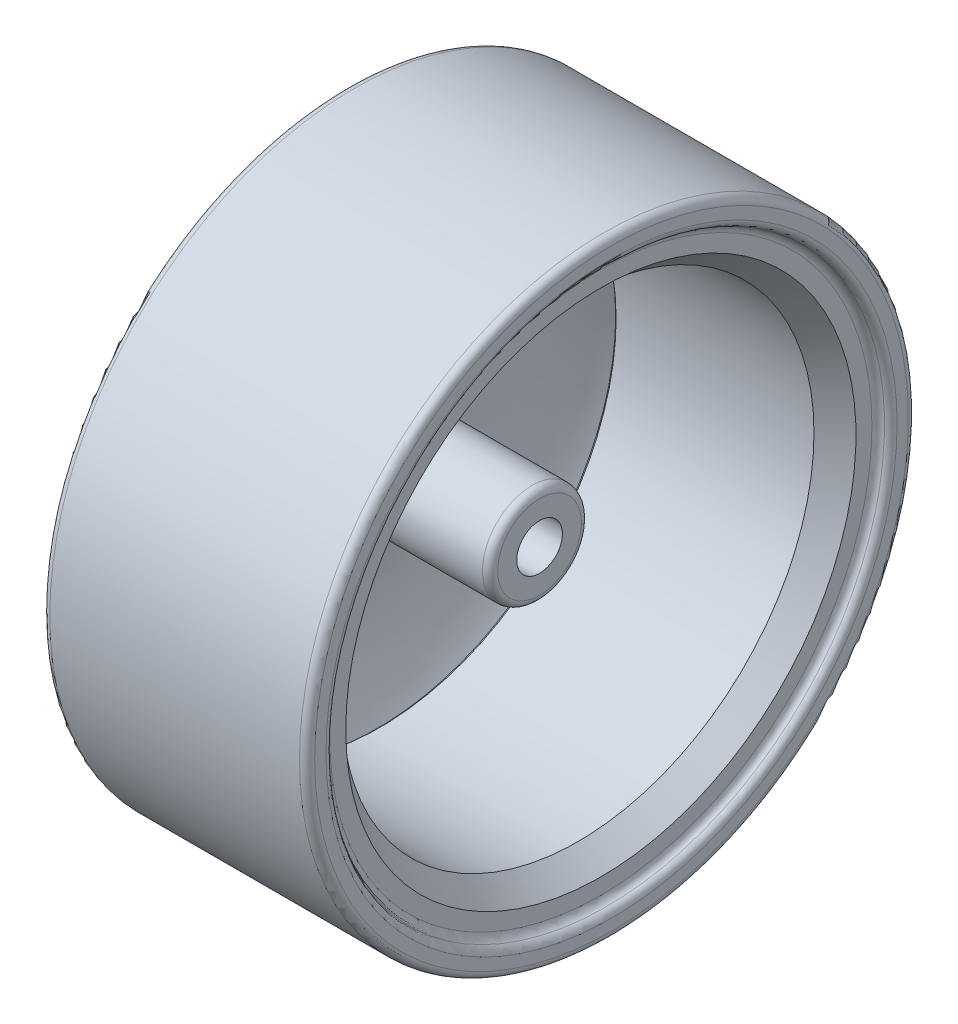
ISO-10303-21;
HEADER;
FILE_DESCRIPTION(('STEP AP214'),'2;1');
FILE_NAME('part.step','',(''),(''),'','','');
FILE_SCHEMA(('AUTOMOTIVE_DESIGN { 1 0 10303 214 1 1 1 1 }'));
ENDSEC;
DATA;
#1=APPLICATION_CONTEXT('core data for automotive mechanical design processes');
#2=APPLICATION_PROTOCOL_DEFINITION('international standard','automotive_design',2000,#1);
#3=PRODUCT_CONTEXT('',#1,'mechanical');
#4=PRODUCT('Part','Part','',(#3));
#5=PRODUCT_RELATED_PRODUCT_CATEGORY('part','',(#4));
#6=PRODUCT_DEFINITION_FORMATION('','',#4);
#7=PRODUCT_DEFINITION_CONTEXT('part definition',#1,'design');
#8=PRODUCT_DEFINITION('design','',#6,#7);
#9=PRODUCT_DEFINITION_SHAPE('','',#8);
#10=(LENGTH_UNIT() NAMED_UNIT(*) SI_UNIT(.MILLI.,.METRE.));
#11=(NAMED_UNIT(*) PLANE_ANGLE_UNIT() SI_UNIT($,.RADIAN.));
#12=(NAMED_UNIT(*) SI_UNIT($,.STERADIAN.) SOLID_ANGLE_UNIT());
#13=UNCERTAINTY_MEASURE_WITH_UNIT(LENGTH_MEASURE(1.E-05),#10,'distance_accuracy_value','');
#14=(GEOMETRIC_REPRESENTATION_CONTEXT(3) GLOBAL_UNCERTAINTY_ASSIGNED_CONTEXT((#13)) GLOBAL_UNIT_ASSIGNED_CONTEXT((#10,
#11,#12)) REPRESENTATION_CONTEXT('',''));
#15=CARTESIAN_POINT('',(0.,0.,0.));
#16=DIRECTION('',(0.,0.,1.));
#17=DIRECTION('',(1.,0.,0.));
#18=AXIS2_PLACEMENT_3D('',#15,#16,#17);
#19=CARTESIAN_POINT('',(-8.,0.,0.));
#20=DIRECTION('',(-1.,0.,0.));
#21=DIRECTION('',(0.,0.,1.));
#22=AXIS2_PLACEMENT_3D('',#19,#20,#21);
#23=CONICAL_SURFACE('',#22,16.7586494467659,0.698131700797733);
#24=CARTESIAN_POINT('',(-8.,0.,0.));
#25=DIRECTION('',(-1.,0.,0.));
#26=DIRECTION('',(0.,0.,1.));
#27=AXIS2_PLACEMENT_3D('',#24,#25,#26);
#28=CIRCLE('',#27,16.7586494467659);
#29=CARTESIAN_POINT('',(-7.99999999999999,0.,16.7586494467659));
#30=VERTEX_POINT('',#29);
#31=EDGE_CURVE('E103',#30,#30,#28,.T.);
#32=ORIENTED_EDGE('',*,*,#31,.T.);
#33=EDGE_LOOP('',(#32));
#34=FACE_BOUND('',#33,.T.);
#35=CARTESIAN_POINT('',(-7.24105039201976,0.,0.));
#36=DIRECTION('',(1.,0.,0.));
#37=DIRECTION('',(0.,0.,-1.));
#38=AXIS2_PLACEMENT_3D('',#35,#36,#37);
#39=CIRCLE('',#38,16.1218151106276);
#40=CARTESIAN_POINT('',(-7.24105039201976,0.,-16.1218151106276));
#41=VERTEX_POINT('',#40);
#42=EDGE_CURVE('E88',#41,#41,#39,.F.);
#43=ORIENTED_EDGE('',*,*,#42,.F.);
#44=EDGE_LOOP('',(#43));
#45=FACE_BOUND('',#44,.T.);
#46=ADVANCED_FACE('F41',(#34,#45),#23,.F.);
#47=CARTESIAN_POINT('',(-6.5,0.,0.));
#48=DIRECTION('',(-1.,0.,0.));
#49=DIRECTION('',(0.,0.,1.));
#50=AXIS2_PLACEMENT_3D('',#47,#48,#49);
#51=CIRCLE('',#50,15.5);
#52=CARTESIAN_POINT('',(-6.49999999999999,0.,15.5));
#53=VERTEX_POINT('',#52);
#54=EDGE_CURVE('E94',#53,#53,#51,.T.);
#55=ORIENTED_EDGE('',*,*,#54,.F.);
#56=EDGE_LOOP('',(#55));
#57=FACE_BOUND('',#56,.T.);
#58=CARTESIAN_POINT('',(-6.66651705968052,0.,0.));
#59=DIRECTION('',(1.,0.,0.));
#60=DIRECTION('',(0.,0.,-1.));
#61=AXIS2_PLACEMENT_3D('',#58,#59,#60);
#62=CIRCLE('',#61,15.6397244033626);
#63=CARTESIAN_POINT('',(-6.66651705968052,0.,-15.6397244033626));
#64=VERTEX_POINT('',#63);
#65=EDGE_CURVE('E91',#64,#64,#62,.T.);
#66=ORIENTED_EDGE('',*,*,#65,.F.);
#67=EDGE_LOOP('',(#66));
#68=FACE_BOUND('',#67,.T.);
#69=ADVANCED_FACE('F153',(#57,#68),#23,.F.);
#70=CARTESIAN_POINT('',(-8.2,0.,0.));
#71=DIRECTION('',(-1.,0.,0.));
#72=DIRECTION('',(0.,0.,1.));
#73=AXIS2_PLACEMENT_3D('',#70,#71,#72);
#74=TOROIDAL_SURFACE('',#73,18.7586494467659,0.5);
#75=CARTESIAN_POINT('',(-8.34999999999998,0.,0.));
#76=DIRECTION('',(1.,0.,0.));
#77=DIRECTION('',(0.,0.,-1.));
#78=AXIS2_PLACEMENT_3D('',#75,#76,#77);
#79=CIRCLE('',#78,18.2816798460575);
#80=CARTESIAN_POINT('',(-8.34999999999998,0.,-18.2816798460575));
#81=VERTEX_POINT('',#80);
#82=EDGE_CURVE('E61',#81,#81,#79,.T.);
#83=ORIENTED_EDGE('',*,*,#82,.T.);
#84=EDGE_LOOP('',(#83));
#85=FACE_BOUND('',#84,.T.);
#86=CARTESIAN_POINT('',(-8.7,0.,0.));
#87=DIRECTION('',(-1.,0.,0.));
#88=DIRECTION('',(0.,0.,1.));
#89=AXIS2_PLACEMENT_3D('',#86,#87,#88);
#90=CIRCLE('',#89,18.7586494467659);
#91=CARTESIAN_POINT('',(-8.69999999999999,0.,18.7586494467659));
#92=VERTEX_POINT('',#91);
#93=EDGE_CURVE('E106',#92,#92,#90,.T.);
#94=ORIENTED_EDGE('',*,*,#93,.T.);
#95=EDGE_LOOP('',(#94));
#96=FACE_BOUND('',#95,.T.);
#97=ADVANCED_FACE('F159',(#85,#96),#74,.T.);
#98=CARTESIAN_POINT('',(-8.7,18.7586494467659,0.));
#99=DIRECTION('',(1.,0.,0.));
#100=DIRECTION('',(0.,0.,-1.));
#101=AXIS2_PLACEMENT_3D('',#98,#99,#100);
#102=PLANE('',#101);
#103=ORIENTED_EDGE('',*,*,#93,.F.);
#104=EDGE_LOOP('',(#103));
#105=FACE_BOUND('',#104,.T.);
#106=CARTESIAN_POINT('',(-8.7,0.,0.));
#107=DIRECTION('',(-1.,0.,0.));
#108=DIRECTION('',(0.,0.,1.));
#109=AXIS2_PLACEMENT_3D('',#106,#107,#108);
#110=CIRCLE('',#109,19.5);
#111=CARTESIAN_POINT('',(-8.69999999999999,0.,19.5));
#112=VERTEX_POINT('',#111);
#113=EDGE_CURVE('E109',#112,#112,#110,.T.);
#114=ORIENTED_EDGE('',*,*,#113,.T.);
#115=EDGE_LOOP('',(#114));
#116=FACE_BOUND('',#115,.T.);
#117=ADVANCED_FACE('F195',(#105,#116),#102,.F.);
#118=CARTESIAN_POINT('',(-8.2,0.,0.));
#119=DIRECTION('',(-1.,0.,0.));
#120=DIRECTION('',(0.,0.,1.));
#121=AXIS2_PLACEMENT_3D('',#118,#119,#120);
#122=TOROIDAL_SURFACE('',#121,19.5,0.5);
#123=ORIENTED_EDGE('',*,*,#113,.F.);
#124=EDGE_LOOP('',(#123));
#125=FACE_BOUND('',#124,.T.);
#126=CARTESIAN_POINT('',(-8.19999999999999,0.,0.));
#127=DIRECTION('',(-1.,0.,0.));
#128=DIRECTION('',(0.,0.,1.));
#129=AXIS2_PLACEMENT_3D('',#126,#127,#128);
#130=CIRCLE('',#129,20.);
#131=CARTESIAN_POINT('',(-8.19999999999999,0.,20.));
#132=VERTEX_POINT('',#131);
#133=EDGE_CURVE('E112',#132,#132,#130,.T.);
#134=ORIENTED_EDGE('',*,*,#133,.T.);
#135=EDGE_LOOP('',(#134));
#136=FACE_BOUND('',#135,.T.);
#137=ADVANCED_FACE('F201',(#125,#136),#122,.T.);
#138=CARTESIAN_POINT('',(-5.,0.,0.));
#139=DIRECTION('',(-1.,0.,0.));
#140=DIRECTION('',(0.,0.,1.));
#141=AXIS2_PLACEMENT_3D('',#138,#139,#140);
#142=CYLINDRICAL_SURFACE('',#141,20.);
#143=ORIENTED_EDGE('',*,*,#133,.F.);
#144=EDGE_LOOP('',(#143));
#145=FACE_BOUND('',#144,.T.);
#146=CARTESIAN_POINT('',(8.20000000000001,0.,0.));
#147=DIRECTION('',(-1.,0.,0.));
#148=DIRECTION('',(0.,0.,1.));
#149=AXIS2_PLACEMENT_3D('',#146,#147,#148);
#150=CIRCLE('',#149,20.);
#151=CARTESIAN_POINT('',(8.20000000000001,0.,20.));
#152=VERTEX_POINT('',#151);
#153=EDGE_CURVE('E115',#152,#152,#150,.T.);
#154=ORIENTED_EDGE('',*,*,#153,.T.);
#155=EDGE_LOOP('',(#154));
#156=FACE_BOUND('',#155,.T.);
#157=ADVANCED_FACE('F207',(#145,#156),#142,.T.);
#158=CARTESIAN_POINT('',(8.20000000000001,0.,0.));
#159=DIRECTION('',(-1.,0.,0.));
#160=DIRECTION('',(0.,0.,1.));
#161=AXIS2_PLACEMENT_3D('',#158,#159,#160);
#162=TOROIDAL_SURFACE('',#161,19.5,0.5);
#163=ORIENTED_EDGE('',*,*,#153,.F.);
#164=EDGE_LOOP('',(#163));
#165=FACE_BOUND('',#164,.T.);
#166=CARTESIAN_POINT('',(8.70000000000001,0.,0.));
#167=DIRECTION('',(-1.,0.,0.));
#168=DIRECTION('',(0.,0.,1.));
#169=AXIS2_PLACEMENT_3D('',#166,#167,#168);
#170=CIRCLE('',#169,19.5);
#171=CARTESIAN_POINT('',(8.70000000000002,0.,19.5));
#172=VERTEX_POINT('',#171);
#173=EDGE_CURVE('E118',#172,#172,#170,.T.);
#174=ORIENTED_EDGE('',*,*,#173,.T.);
#175=EDGE_LOOP('',(#174));
#176=FACE_BOUND('',#175,.T.);
#177=ADVANCED_FACE('F213',(#165,#176),#162,.T.);
#178=CARTESIAN_POINT('',(8.70000000000001,19.5,0.));
#179=DIRECTION('',(-1.,0.,0.));
#180=DIRECTION('',(0.,0.,1.));
#181=AXIS2_PLACEMENT_3D('',#178,#179,#180);
#182=PLANE('',#181);
#183=ORIENTED_EDGE('',*,*,#173,.F.);
#184=EDGE_LOOP('',(#183));
#185=FACE_BOUND('',#184,.T.);
#186=CARTESIAN_POINT('',(8.70000000000002,0.,0.));
#187=DIRECTION('',(-1.,0.,0.));
#188=DIRECTION('',(0.,0.,1.));
#189=AXIS2_PLACEMENT_3D('',#186,#187,#188);
#190=CIRCLE('',#189,18.7586494467659);
#191=CARTESIAN_POINT('',(8.70000000000002,0.,18.7586494467659));
#192=VERTEX_POINT('',#191);
#193=EDGE_CURVE('E121',#192,#192,#190,.T.);
#194=ORIENTED_EDGE('',*,*,#193,.T.);
#195=EDGE_LOOP('',(#194));
#196=FACE_BOUND('',#195,.T.);
#197=ADVANCED_FACE('F219',(#185,#196),#182,.F.);
#198=CARTESIAN_POINT('',(8.20000000000002,0.,0.));
#199=DIRECTION('',(-1.,0.,0.));
#200=DIRECTION('',(0.,0.,1.));
#201=AXIS2_PLACEMENT_3D('',#198,#199,#200);
#202=TOROIDAL_SURFACE('',#201,18.7586494467659,0.5);
#203=CARTESIAN_POINT('',(8.35,0.,0.));
#204=DIRECTION('',(-1.,0.,0.));
#205=DIRECTION('',(0.,0.,1.));
#206=AXIS2_PLACEMENT_3D('',#203,#204,#205);
#207=CIRCLE('',#206,18.2816798460575);
#208=CARTESIAN_POINT('',(8.35,0.,18.2816798460575));
#209=VERTEX_POINT('',#208);
#210=EDGE_CURVE('E67',#209,#209,#207,.T.);
#211=ORIENTED_EDGE('',*,*,#210,.T.);
#212=EDGE_LOOP('',(#211));
#213=FACE_BOUND('',#212,.T.);
#214=ORIENTED_EDGE('',*,*,#193,.F.);
#215=EDGE_LOOP('',(#214));
#216=FACE_BOUND('',#215,.T.);
#217=ADVANCED_FACE('F225',(#213,#216),#202,.T.);
#218=CARTESIAN_POINT('',(-5.,0.,0.));
#219=DIRECTION('',(-1.,0.,0.));
#220=DIRECTION('',(0.,0.,1.));
#221=AXIS2_PLACEMENT_3D('',#218,#219,#220);
#222=CYLINDRICAL_SURFACE('',#221,15.5);
#223=CARTESIAN_POINT('',(6.5,0.,0.));
#224=DIRECTION('',(-1.,0.,0.));
#225=DIRECTION('',(0.,0.,1.));
#226=AXIS2_PLACEMENT_3D('',#223,#224,#225);
#227=CIRCLE('',#226,15.5);
#228=CARTESIAN_POINT('',(6.50000000000001,0.,15.5));
#229=VERTEX_POINT('',#228);
#230=EDGE_CURVE('E97',#229,#229,#227,.T.);
#231=ORIENTED_EDGE('',*,*,#230,.F.);
#232=EDGE_LOOP('',(#231));
#233=FACE_BOUND('',#232,.T.);
#234=ORIENTED_EDGE('',*,*,#54,.T.);
#235=EDGE_LOOP('',(#234));
#236=FACE_BOUND('',#235,.T.);
#237=ADVANCED_FACE('F164',(#233,#236),#222,.F.);
#238=CARTESIAN_POINT('',(6.5,0.,0.));
#239=DIRECTION('',(1.,0.,0.));
#240=DIRECTION('',(0.,0.,-1.));
#241=AXIS2_PLACEMENT_3D('',#238,#239,#240);
#242=CONICAL_SURFACE('',#241,15.5,0.698131700797736);
#243=CARTESIAN_POINT('',(8.00000000000002,0.,0.));
#244=DIRECTION('',(-1.,0.,0.));
#245=DIRECTION('',(0.,0.,1.));
#246=AXIS2_PLACEMENT_3D('',#243,#244,#245);
#247=CIRCLE('',#246,16.7586494467659);
#248=CARTESIAN_POINT('',(8.00000000000002,0.,16.7586494467659));
#249=VERTEX_POINT('',#248);
#250=EDGE_CURVE('E100',#249,#249,#247,.T.);
#251=ORIENTED_EDGE('',*,*,#250,.F.);
#252=EDGE_LOOP('',(#251));
#253=FACE_BOUND('',#252,.T.);
#254=ORIENTED_EDGE('',*,*,#230,.T.);
#255=EDGE_LOOP('',(#254));
#256=FACE_BOUND('',#255,.T.);
#257=ADVANCED_FACE('F236',(#253,#256),#242,.F.);
#258=CARTESIAN_POINT('',(8.00000000000001,0.,-16.7586494467659));
#259=DIRECTION('',(-1.,0.,0.));
#260=DIRECTION('',(0.,0.,1.));
#261=AXIS2_PLACEMENT_3D('',#258,#259,#260);
#262=PLANE('',#261);
#263=CARTESIAN_POINT('',(8.00000000000002,0.,0.));
#264=DIRECTION('',(-1.,0.,0.));
#265=DIRECTION('',(0.,0.,1.));
#266=AXIS2_PLACEMENT_3D('',#263,#264,#265);
#267=CIRCLE('',#266,17.804710245349);
#268=CARTESIAN_POINT('',(8.00000000000002,0.,17.804710245349));
#269=VERTEX_POINT('',#268);
#270=EDGE_CURVE('E64',#269,#269,#267,.F.);
#271=ORIENTED_EDGE('',*,*,#270,.T.);
#272=EDGE_LOOP('',(#271));
#273=FACE_BOUND('',#272,.T.);
#274=ORIENTED_EDGE('',*,*,#250,.T.);
#275=EDGE_LOOP('',(#274));
#276=FACE_BOUND('',#275,.T.);
#277=ADVANCED_FACE('F148',(#273,#276),#262,.F.);
#278=CARTESIAN_POINT('',(-8.,0.,-16.7586494467659));
#279=DIRECTION('',(1.,0.,0.));
#280=DIRECTION('',(0.,0.,-1.));
#281=AXIS2_PLACEMENT_3D('',#278,#279,#280);
#282=PLANE('',#281);
#283=CARTESIAN_POINT('',(-8.,0.,0.));
#284=DIRECTION('',(1.,0.,0.));
#285=DIRECTION('',(0.,0.,-1.));
#286=AXIS2_PLACEMENT_3D('',#283,#284,#285);
#287=CIRCLE('',#286,17.804710245349);
#288=CARTESIAN_POINT('',(-8.,0.,-17.804710245349));
#289=VERTEX_POINT('',#288);
#290=EDGE_CURVE('E56',#289,#289,#287,.F.);
#291=ORIENTED_EDGE('',*,*,#290,.T.);
#292=EDGE_LOOP('',(#291));
#293=FACE_BOUND('',#292,.T.);
#294=ORIENTED_EDGE('',*,*,#31,.F.);
#295=EDGE_LOOP('',(#294));
#296=FACE_BOUND('',#295,.T.);
#297=ADVANCED_FACE('F140',(#293,#296),#282,.F.);
#298=CARTESIAN_POINT('',(3.97209404087926,0.,-2.5));
#299=DIRECTION('',(-1.,0.,0.));
#300=DIRECTION('',(0.,0.,1.));
#301=AXIS2_PLACEMENT_3D('',#298,#299,#300);
#302=PLANE('',#301);
#303=CARTESIAN_POINT('',(3.97209404087926,0.,0.));
#304=DIRECTION('',(-1.,0.,0.));
#305=DIRECTION('',(0.,0.,1.));
#306=AXIS2_PLACEMENT_3D('',#303,#304,#305);
#307=CIRCLE('',#306,2.75);
#308=CARTESIAN_POINT('',(3.97209404087926,0.,2.75));
#309=VERTEX_POINT('',#308);
#310=EDGE_CURVE('E10',#309,#309,#307,.F.);
#311=ORIENTED_EDGE('',*,*,#310,.T.);
#312=EDGE_LOOP('',(#311));
#313=FACE_BOUND('',#312,.T.);
#314=CARTESIAN_POINT('',(3.97209404087926,0.,0.));
#315=DIRECTION('',(1.,0.,0.));
#316=DIRECTION('',(0.,0.,-1.));
#317=AXIS2_PLACEMENT_3D('',#314,#315,#316);
#318=CIRCLE('',#317,1.5);
#319=CARTESIAN_POINT('',(3.97209404087926,0.,-1.5));
#320=VERTEX_POINT('',#319);
#321=EDGE_CURVE('E130',#320,#320,#318,.T.);
#322=ORIENTED_EDGE('',*,*,#321,.F.);
#323=EDGE_LOOP('',(#322));
#324=FACE_BOUND('',#323,.T.);
#325=ADVANCED_FACE('F137',(#313,#324),#302,.F.);
#326=CARTESIAN_POINT('',(-5.,0.,0.));
#327=DIRECTION('',(-1.,0.,0.));
#328=DIRECTION('',(0.,0.,1.));
#329=AXIS2_PLACEMENT_3D('',#326,#327,#328);
#330=CYLINDRICAL_SURFACE('',#329,3.25);
#331=CARTESIAN_POINT('',(3.47209404087926,0.,0.));
#332=DIRECTION('',(-1.,0.,0.));
#333=DIRECTION('',(0.,0.,1.));
#334=AXIS2_PLACEMENT_3D('',#331,#332,#333);
#335=CIRCLE('',#334,3.25);
#336=CARTESIAN_POINT('',(3.47209404087926,0.,3.25));
#337=VERTEX_POINT('',#336);
#338=EDGE_CURVE('E48',#337,#337,#335,.T.);
#339=ORIENTED_EDGE('',*,*,#338,.T.);
#340=EDGE_LOOP('',(#339));
#341=FACE_BOUND('',#340,.T.);
#342=CARTESIAN_POINT('',(-7.27790595912074,0.,0.));
#343=DIRECTION('',(-1.,0.,0.));
#344=DIRECTION('',(0.,0.,1.));
#345=AXIS2_PLACEMENT_3D('',#342,#343,#344);
#346=CIRCLE('',#345,3.25);
#347=CARTESIAN_POINT('',(-7.27790595912074,0.,3.25));
#348=VERTEX_POINT('',#347);
#349=EDGE_CURVE('E127',#348,#348,#346,.T.);
#350=ORIENTED_EDGE('',*,*,#349,.F.);
#351=EDGE_LOOP('',(#350));
#352=FACE_BOUND('',#351,.T.);
#353=ADVANCED_FACE('F139',(#341,#352),#330,.T.);
#354=CARTESIAN_POINT('',(-7.27790595912074,0.,-3.25));
#355=DIRECTION('',(-1.,0.,0.));
#356=DIRECTION('',(0.,0.,1.));
#357=AXIS2_PLACEMENT_3D('',#354,#355,#356);
#358=PLANE('',#357);
#359=CARTESIAN_POINT('',(-7.27790595912074,0.,0.));
#360=DIRECTION('',(-1.,0.,0.));
#361=DIRECTION('',(0.,0.,1.));
#362=AXIS2_PLACEMENT_3D('',#359,#360,#361);
#363=CIRCLE('',#362,4.35109346346808);
#364=CARTESIAN_POINT('',(-7.27790595912074,0.,4.35109346346808));
#365=VERTEX_POINT('',#364);
#366=EDGE_CURVE('E124',#365,#365,#363,.T.);
#367=ORIENTED_EDGE('',*,*,#366,.F.);
#368=EDGE_LOOP('',(#367));
#369=FACE_BOUND('',#368,.T.);
#370=ORIENTED_EDGE('',*,*,#349,.T.);
#371=EDGE_LOOP('',(#370));
#372=FACE_BOUND('',#371,.T.);
#373=ADVANCED_FACE('F146',(#369,#372),#358,.F.);
#374=CARTESIAN_POINT('',(4.14558135212684,0.,0.));
#375=DIRECTION('',(-1.,0.,0.));
#376=DIRECTION('',(0.,0.,1.));
#377=AXIS2_PLACEMENT_3D('',#374,#375,#376);
#378=DEGENERATE_TOROIDAL_SURFACE('',#377,9.39327257356755,12.4867783086174,.T.);
#379=ORIENTED_EDGE('',*,*,#65,.T.);
#380=EDGE_LOOP('',(#379));
#381=FACE_BOUND('',#380,.T.);
#382=ORIENTED_EDGE('',*,*,#366,.T.);
#383=EDGE_LOOP('',(#382));
#384=FACE_BOUND('',#383,.T.);
#385=ADVANCED_FACE('F255',(#381,#384),#378,.F.);
#386=CARTESIAN_POINT('',(-6.52790595912074,0.,-2.5));
#387=DIRECTION('',(1.,0.,0.));
#388=DIRECTION('',(0.,0.,-1.));
#389=AXIS2_PLACEMENT_3D('',#386,#387,#388);
#390=PLANE('',#389);
#391=CARTESIAN_POINT('',(-6.52790595912074,0.,0.));
#392=DIRECTION('',(1.,0.,0.));
#393=DIRECTION('',(0.,0.,-1.));
#394=AXIS2_PLACEMENT_3D('',#391,#392,#393);
#395=CIRCLE('',#394,2.);
#396=CARTESIAN_POINT('',(-6.52790595912074,0.,-2.));
#397=VERTEX_POINT('',#396);
#398=EDGE_CURVE('E70',#397,#397,#395,.F.);
#399=ORIENTED_EDGE('',*,*,#398,.T.);
#400=EDGE_LOOP('',(#399));
#401=FACE_BOUND('',#400,.T.);
#402=ADVANCED_FACE('F258',(#401),#390,.F.);
#403=CARTESIAN_POINT('',(-5.,0.,0.));
#404=DIRECTION('',(-1.,0.,0.));
#405=DIRECTION('',(0.,0.,1.));
#406=AXIS2_PLACEMENT_3D('',#403,#404,#405);
#407=CYLINDRICAL_SURFACE('',#406,2.5);
#408=CARTESIAN_POINT('',(-7.52790595912074,0.,0.));
#409=DIRECTION('',(1.,0.,0.));
#410=DIRECTION('',(0.,0.,-1.));
#411=AXIS2_PLACEMENT_3D('',#408,#409,#410);
#412=CIRCLE('',#411,2.5);
#413=CARTESIAN_POINT('',(-7.52790595912074,0.,-2.5));
#414=VERTEX_POINT('',#413);
#415=EDGE_CURVE('E73',#414,#414,#412,.F.);
#416=ORIENTED_EDGE('',*,*,#415,.T.);
#417=EDGE_LOOP('',(#416));
#418=FACE_BOUND('',#417,.T.);
#419=CARTESIAN_POINT('',(-7.02790595912074,0.,0.));
#420=DIRECTION('',(1.,0.,0.));
#421=DIRECTION('',(0.,0.,-1.));
#422=AXIS2_PLACEMENT_3D('',#419,#420,#421);
#423=CIRCLE('',#422,2.5);
#424=CARTESIAN_POINT('',(-7.02790595912074,0.,-2.5));
#425=VERTEX_POINT('',#424);
#426=EDGE_CURVE('E76',#425,#425,#423,.T.);
#427=ORIENTED_EDGE('',*,*,#426,.T.);
#428=EDGE_LOOP('',(#427));
#429=FACE_BOUND('',#428,.T.);
#430=ADVANCED_FACE('F276',(#418,#429),#407,.F.);
#431=CARTESIAN_POINT('',(-8.02790595912074,0.,-2.5));
#432=DIRECTION('',(1.,0.,0.));
#433=DIRECTION('',(0.,0.,-1.));
#434=AXIS2_PLACEMENT_3D('',#431,#432,#433);
#435=PLANE('',#434);
#436=CARTESIAN_POINT('',(-8.02790595912074,0.,0.));
#437=DIRECTION('',(1.,0.,0.));
#438=DIRECTION('',(0.,0.,-1.));
#439=AXIS2_PLACEMENT_3D('',#436,#437,#438);
#440=CIRCLE('',#439,4.26281824405252);
#441=CARTESIAN_POINT('',(-8.02790595912074,0.,-4.26281824405252));
#442=VERTEX_POINT('',#441);
#443=EDGE_CURVE('E82',#442,#442,#440,.F.);
#444=ORIENTED_EDGE('',*,*,#443,.T.);
#445=EDGE_LOOP('',(#444));
#446=FACE_BOUND('',#445,.T.);
#447=CARTESIAN_POINT('',(-8.02790595912074,0.,0.));
#448=DIRECTION('',(1.,0.,0.));
#449=DIRECTION('',(0.,0.,-1.));
#450=AXIS2_PLACEMENT_3D('',#447,#448,#449);
#451=CIRCLE('',#450,3.);
#452=CARTESIAN_POINT('',(-8.02790595912074,0.,-3.));
#453=VERTEX_POINT('',#452);
#454=EDGE_CURVE('E85',#453,#453,#451,.T.);
#455=ORIENTED_EDGE('',*,*,#454,.T.);
#456=EDGE_LOOP('',(#455));
#457=FACE_BOUND('',#456,.T.);
#458=ADVANCED_FACE('F272',(#446,#457),#435,.F.);
#459=CARTESIAN_POINT('',(5.57040110285075,0.,0.));
#460=DIRECTION('',(-1.,0.,0.));
#461=DIRECTION('',(0.,0.,1.));
#462=AXIS2_PLACEMENT_3D('',#459,#460,#461);
#463=DEGENERATE_TOROIDAL_SURFACE('',#462,9.35372737491925,14.4893167887125,.T.);
#464=CARTESIAN_POINT('',(-8.0576274514109,0.,0.));
#465=DIRECTION('',(1.,0.,0.));
#466=DIRECTION('',(0.,0.,-1.));
#467=AXIS2_PLACEMENT_3D('',#464,#465,#466);
#468=CIRCLE('',#467,4.43263616179445);
#469=CARTESIAN_POINT('',(-8.0576274514109,0.,-4.43263616179445));
#470=VERTEX_POINT('',#469);
#471=EDGE_CURVE('E79',#470,#470,#468,.T.);
#472=ORIENTED_EDGE('',*,*,#471,.T.);
#473=EDGE_LOOP('',(#472));
#474=FACE_BOUND('',#473,.T.);
#475=ORIENTED_EDGE('',*,*,#42,.T.);
#476=EDGE_LOOP('',(#475));
#477=FACE_BOUND('',#476,.T.);
#478=ADVANCED_FACE('F170',(#474,#477),#463,.T.);
#479=CARTESIAN_POINT('',(-8.52790595912074,0.,0.));
#480=DIRECTION('',(-1.,0.,0.));
#481=DIRECTION('',(0.,0.,1.));
#482=AXIS2_PLACEMENT_3D('',#479,#480,#481);
#483=TOROIDAL_SURFACE('',#482,4.26281824405252,0.5);
#484=ORIENTED_EDGE('',*,*,#471,.F.);
#485=EDGE_LOOP('',(#484));
#486=FACE_BOUND('',#485,.T.);
#487=ORIENTED_EDGE('',*,*,#443,.F.);
#488=EDGE_LOOP('',(#487));
#489=FACE_BOUND('',#488,.T.);
#490=ADVANCED_FACE('F166',(#486,#489),#483,.F.);
#491=CARTESIAN_POINT('',(-7.52790595912074,0.,0.));
#492=DIRECTION('',(1.,0.,0.));
#493=DIRECTION('',(0.,0.,-1.));
#494=AXIS2_PLACEMENT_3D('',#491,#492,#493);
#495=TOROIDAL_SURFACE('',#494,3.,0.5);
#496=ORIENTED_EDGE('',*,*,#454,.F.);
#497=EDGE_LOOP('',(#496));
#498=FACE_BOUND('',#497,.T.);
#499=ORIENTED_EDGE('',*,*,#415,.F.);
#500=EDGE_LOOP('',(#499));
#501=FACE_BOUND('',#500,.T.);
#502=ADVANCED_FACE('F169',(#498,#501),#495,.T.);
#503=CARTESIAN_POINT('',(-7.02790595912074,0.,0.));
#504=DIRECTION('',(1.,0.,0.));
#505=DIRECTION('',(0.,0.,-1.));
#506=AXIS2_PLACEMENT_3D('',#503,#504,#505);
#507=TOROIDAL_SURFACE('',#506,2.,0.5);
#508=ORIENTED_EDGE('',*,*,#426,.F.);
#509=EDGE_LOOP('',(#508));
#510=FACE_BOUND('',#509,.T.);
#511=ORIENTED_EDGE('',*,*,#398,.F.);
#512=EDGE_LOOP('',(#511));
#513=FACE_BOUND('',#512,.T.);
#514=ADVANCED_FACE('F174',(#510,#513),#507,.F.);
#515=CARTESIAN_POINT('',(8.50000000000002,0.,0.));
#516=DIRECTION('',(1.,0.,0.));
#517=DIRECTION('',(0.,0.,-1.));
#518=AXIS2_PLACEMENT_3D('',#515,#516,#517);
#519=TOROIDAL_SURFACE('',#518,17.804710245349,0.5);
#520=ORIENTED_EDGE('',*,*,#270,.F.);
#521=EDGE_LOOP('',(#520));
#522=FACE_BOUND('',#521,.T.);
#523=ORIENTED_EDGE('',*,*,#210,.F.);
#524=EDGE_LOOP('',(#523));
#525=FACE_BOUND('',#524,.T.);
#526=ADVANCED_FACE('F178',(#522,#525),#519,.F.);
#527=CARTESIAN_POINT('',(-8.5,0.,0.));
#528=DIRECTION('',(-1.,0.,0.));
#529=DIRECTION('',(0.,0.,1.));
#530=AXIS2_PLACEMENT_3D('',#527,#528,#529);
#531=TOROIDAL_SURFACE('',#530,17.804710245349,0.5);
#532=ORIENTED_EDGE('',*,*,#290,.F.);
#533=EDGE_LOOP('',(#532));
#534=FACE_BOUND('',#533,.T.);
#535=ORIENTED_EDGE('',*,*,#82,.F.);
#536=EDGE_LOOP('',(#535));
#537=FACE_BOUND('',#536,.T.);
#538=ADVANCED_FACE('F181',(#534,#537),#531,.F.);
#539=CARTESIAN_POINT('',(-6.02790595912074,0.,0.));
#540=DIRECTION('',(1.,0.,0.));
#541=DIRECTION('',(0.,0.,-1.));
#542=AXIS2_PLACEMENT_3D('',#539,#540,#541);
#543=CYLINDRICAL_SURFACE('',#542,1.5);
#544=ORIENTED_EDGE('',*,*,#321,.T.);
#545=EDGE_LOOP('',(#544));
#546=FACE_BOUND('',#545,.T.);
#547=CARTESIAN_POINT('',(-5.77790595912074,0.,0.));
#548=DIRECTION('',(-1.,0.,0.));
#549=DIRECTION('',(0.,0.,1.));
#550=AXIS2_PLACEMENT_3D('',#547,#548,#549);
#551=CIRCLE('',#550,1.5);
#552=CARTESIAN_POINT('',(-5.77790595912074,0.,1.5));
#553=VERTEX_POINT('',#552);
#554=EDGE_CURVE('E52',#553,#553,#551,.T.);
#555=ORIENTED_EDGE('',*,*,#554,.T.);
#556=EDGE_LOOP('',(#555));
#557=FACE_BOUND('',#556,.T.);
#558=ADVANCED_FACE('F134',(#546,#557),#543,.F.);
#559=CARTESIAN_POINT('',(-5.77790595912074,0.,0.));
#560=DIRECTION('',(-1.,0.,0.));
#561=DIRECTION('',(0.,0.,1.));
#562=AXIS2_PLACEMENT_3D('',#559,#560,#561);
#563=PLANE('',#562);
#564=ORIENTED_EDGE('',*,*,#554,.F.);
#565=EDGE_LOOP('',(#564));
#566=FACE_BOUND('',#565,.T.);
#567=ADVANCED_FACE('F188',(#566),#563,.F.);
#568=CARTESIAN_POINT('',(3.47209404087926,0.,0.));
#569=DIRECTION('',(-1.,0.,0.));
#570=DIRECTION('',(0.,0.,1.));
#571=AXIS2_PLACEMENT_3D('',#568,#569,#570);
#572=TOROIDAL_SURFACE('',#571,2.75,0.5);
#573=ORIENTED_EDGE('',*,*,#310,.F.);
#574=EDGE_LOOP('',(#573));
#575=FACE_BOUND('',#574,.T.);
#576=ORIENTED_EDGE('',*,*,#338,.F.);
#577=EDGE_LOOP('',(#576));
#578=FACE_BOUND('',#577,.T.);
#579=ADVANCED_FACE('F43',(#575,#578),#572,.T.);
#580=CLOSED_SHELL('',(#46,#69,#97,#117,#137,#157,#177,#197,#217,#237,#257,#277,#297,#325,#353,
#373,#385,#402,#430,#458,#478,#490,#502,#514,#526,#538,#558,#567,#579));
#581=MANIFOLD_SOLID_BREP('B2',#580);
#582=ADVANCED_BREP_SHAPE_REPRESENTATION('',(#18,#581),#14);
#583=SHAPE_DEFINITION_REPRESENTATION(#9,#582);
ENDSEC;
END-ISO-10303-21;
